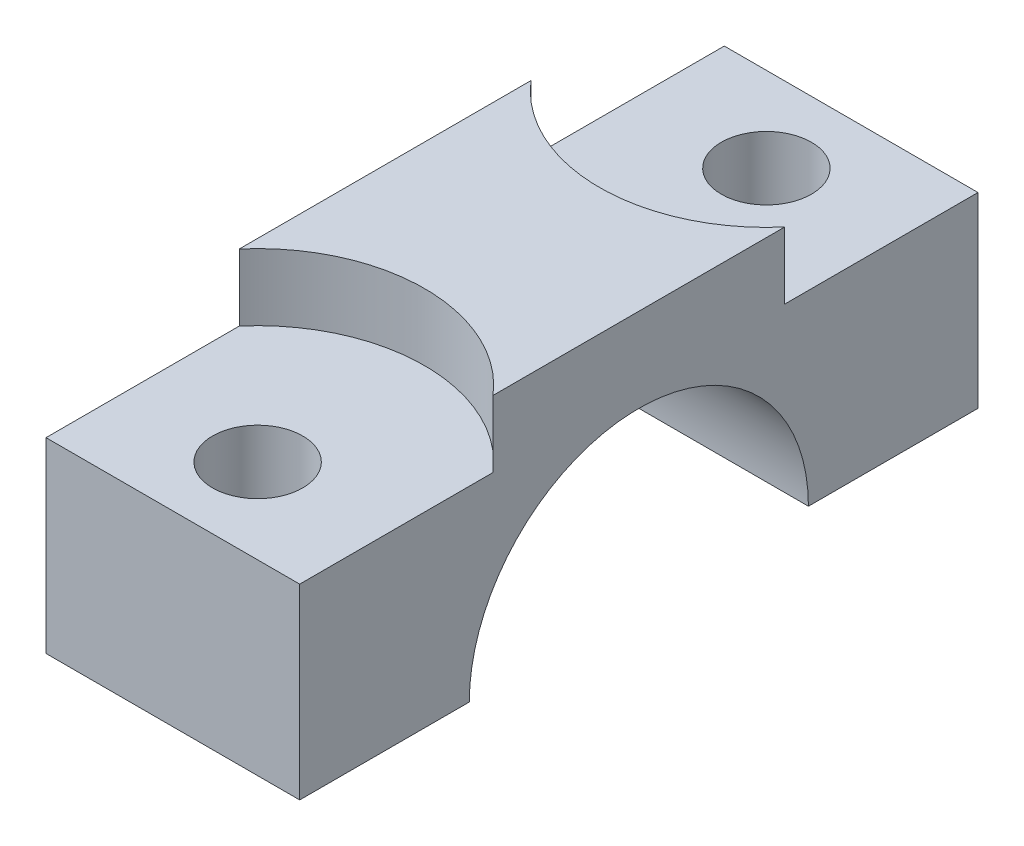
ISO-10303-21;
HEADER;
FILE_DESCRIPTION(('STEP AP214'),'2;1');
FILE_NAME('part.step','',(''),(''),'','','');
FILE_SCHEMA(('AUTOMOTIVE_DESIGN { 1 0 10303 214 1 1 1 1 }'));
ENDSEC;
DATA;
#1=APPLICATION_CONTEXT('core data for automotive mechanical design processes');
#2=APPLICATION_PROTOCOL_DEFINITION('international standard','automotive_design',2000,#1);
#3=PRODUCT_CONTEXT('',#1,'mechanical');
#4=PRODUCT('Part','Part','',(#3));
#5=PRODUCT_RELATED_PRODUCT_CATEGORY('part','',(#4));
#6=PRODUCT_DEFINITION_FORMATION('','',#4);
#7=PRODUCT_DEFINITION_CONTEXT('part definition',#1,'design');
#8=PRODUCT_DEFINITION('design','',#6,#7);
#9=PRODUCT_DEFINITION_SHAPE('','',#8);
#10=(LENGTH_UNIT() NAMED_UNIT(*) SI_UNIT(.MILLI.,.METRE.));
#11=(NAMED_UNIT(*) PLANE_ANGLE_UNIT() SI_UNIT($,.RADIAN.));
#12=(NAMED_UNIT(*) SI_UNIT($,.STERADIAN.) SOLID_ANGLE_UNIT());
#13=UNCERTAINTY_MEASURE_WITH_UNIT(LENGTH_MEASURE(1.E-05),#10,'distance_accuracy_value','');
#14=(GEOMETRIC_REPRESENTATION_CONTEXT(3) GLOBAL_UNCERTAINTY_ASSIGNED_CONTEXT((#13)) GLOBAL_UNIT_ASSIGNED_CONTEXT((#10,
#11,#12)) REPRESENTATION_CONTEXT('',''));
#15=CARTESIAN_POINT('',(0.,0.,0.));
#16=DIRECTION('',(0.,0.,1.));
#17=DIRECTION('',(1.,0.,0.));
#18=AXIS2_PLACEMENT_3D('',#15,#16,#17);
#19=CARTESIAN_POINT('',(9.5,0.,0.));
#20=DIRECTION('',(-1.,0.,0.));
#21=DIRECTION('',(0.,0.,1.));
#22=AXIS2_PLACEMENT_3D('',#19,#20,#21);
#23=CYLINDRICAL_SURFACE('',#22,12.7);
#24=CARTESIAN_POINT('',(-9.5,0.,0.));
#25=DIRECTION('',(1.,0.,0.));
#26=DIRECTION('',(0.,0.,-1.));
#27=AXIS2_PLACEMENT_3D('',#24,#25,#26);
#28=CIRCLE('',#27,12.7);
#29=CARTESIAN_POINT('',(-9.5,0.,-12.7));
#30=VERTEX_POINT('',#29);
#31=CARTESIAN_POINT('',(-9.5,0.,12.7));
#32=VERTEX_POINT('',#31);
#33=EDGE_CURVE('E152',#30,#32,#28,.T.);
#34=ORIENTED_EDGE('',*,*,#33,.F.);
#35=DIRECTION('',(-1.,0.,0.));
#36=VECTOR('',#35,1.);
#37=CARTESIAN_POINT('',(9.5,0.,-12.7));
#38=LINE('',#37,#36);
#39=CARTESIAN_POINT('',(9.5,0.,-12.7));
#40=VERTEX_POINT('',#39);
#41=EDGE_CURVE('E185',#40,#30,#38,.T.);
#42=ORIENTED_EDGE('',*,*,#41,.F.);
#43=CARTESIAN_POINT('',(9.5,0.,0.));
#44=DIRECTION('',(1.,0.,0.));
#45=DIRECTION('',(0.,0.,-1.));
#46=AXIS2_PLACEMENT_3D('',#43,#44,#45);
#47=CIRCLE('',#46,12.7);
#48=CARTESIAN_POINT('',(9.5,0.,12.7));
#49=VERTEX_POINT('',#48);
#50=EDGE_CURVE('E153',#40,#49,#47,.T.);
#51=ORIENTED_EDGE('',*,*,#50,.T.);
#52=DIRECTION('',(-1.,0.,0.));
#53=VECTOR('',#52,1.);
#54=CARTESIAN_POINT('',(9.5,0.,12.7));
#55=LINE('',#54,#53);
#56=EDGE_CURVE('E177',#49,#32,#55,.T.);
#57=ORIENTED_EDGE('',*,*,#56,.T.);
#58=EDGE_LOOP('',(#34,#42,#51,#57));
#59=FACE_BOUND('',#58,.T.);
#60=ADVANCED_FACE('F35',(#59),#23,.F.);
#61=CARTESIAN_POINT('',(9.5,0.,0.));
#62=DIRECTION('',(0.,1.,0.));
#63=DIRECTION('',(0.,0.,1.));
#64=AXIS2_PLACEMENT_3D('',#61,#62,#63);
#65=PLANE('',#64);
#66=CARTESIAN_POINT('',(0.,0.,-19.05));
#67=DIRECTION('',(0.,1.,0.));
#68=DIRECTION('',(0.,0.,1.));
#69=AXIS2_PLACEMENT_3D('',#66,#67,#68);
#70=CIRCLE('',#69,3.37500000000001);
#71=CARTESIAN_POINT('',(0.,0.,-15.675));
#72=VERTEX_POINT('',#71);
#73=EDGE_CURVE('E118',#72,#72,#70,.T.);
#74=ORIENTED_EDGE('',*,*,#73,.T.);
#75=EDGE_LOOP('',(#74));
#76=FACE_BOUND('',#75,.T.);
#77=DIRECTION('',(0.,0.,-1.));
#78=VECTOR('',#77,1.);
#79=CARTESIAN_POINT('',(-9.5,0.,0.));
#80=LINE('',#79,#78);
#81=CARTESIAN_POINT('',(-9.5,0.,-25.4));
#82=VERTEX_POINT('',#81);
#83=EDGE_CURVE('E167',#30,#82,#80,.T.);
#84=ORIENTED_EDGE('',*,*,#83,.T.);
#85=DIRECTION('',(-1.,0.,0.));
#86=VECTOR('',#85,1.);
#87=CARTESIAN_POINT('',(9.5,0.,-25.4));
#88=LINE('',#87,#86);
#89=CARTESIAN_POINT('',(9.5,0.,-25.4));
#90=VERTEX_POINT('',#89);
#91=EDGE_CURVE('E182',#90,#82,#88,.T.);
#92=ORIENTED_EDGE('',*,*,#91,.F.);
#93=DIRECTION('',(0.,0.,-1.));
#94=VECTOR('',#93,1.);
#95=CARTESIAN_POINT('',(9.5,0.,0.));
#96=LINE('',#95,#94);
#97=EDGE_CURVE('E156',#40,#90,#96,.T.);
#98=ORIENTED_EDGE('',*,*,#97,.F.);
#99=ORIENTED_EDGE('',*,*,#41,.T.);
#100=EDGE_LOOP('',(#84,#92,#98,#99));
#101=FACE_BOUND('',#100,.T.);
#102=ADVANCED_FACE('F204',(#76,#101),#65,.F.);
#103=CARTESIAN_POINT('',(9.5,0.,-25.4));
#104=DIRECTION('',(0.,0.,-1.));
#105=DIRECTION('',(-1.,0.,0.));
#106=AXIS2_PLACEMENT_3D('',#103,#104,#105);
#107=PLANE('',#106);
#108=DIRECTION('',(-1.,0.,0.));
#109=VECTOR('',#108,1.);
#110=CARTESIAN_POINT('',(9.5,14.,-25.4));
#111=LINE('',#110,#109);
#112=CARTESIAN_POINT('',(9.5,14.,-25.4));
#113=VERTEX_POINT('',#112);
#114=CARTESIAN_POINT('',(-9.5,14.,-25.4));
#115=VERTEX_POINT('',#114);
#116=EDGE_CURVE('E117',#113,#115,#111,.T.);
#117=ORIENTED_EDGE('',*,*,#116,.F.);
#118=DIRECTION('',(0.,-1.,0.));
#119=VECTOR('',#118,1.);
#120=CARTESIAN_POINT('',(9.5,0.,-25.4));
#121=LINE('',#120,#119);
#122=EDGE_CURVE('E131',#113,#90,#121,.T.);
#123=ORIENTED_EDGE('',*,*,#122,.T.);
#124=ORIENTED_EDGE('',*,*,#91,.T.);
#125=DIRECTION('',(0.,-1.,0.));
#126=VECTOR('',#125,1.);
#127=CARTESIAN_POINT('',(-9.5,0.,-25.4));
#128=LINE('',#127,#126);
#129=EDGE_CURVE('E170',#115,#82,#128,.T.);
#130=ORIENTED_EDGE('',*,*,#129,.F.);
#131=EDGE_LOOP('',(#117,#123,#124,#130));
#132=FACE_BOUND('',#131,.T.);
#133=ADVANCED_FACE('F224',(#132),#107,.T.);
#134=CARTESIAN_POINT('',(9.5,19.,0.));
#135=DIRECTION('',(0.,1.,0.));
#136=DIRECTION('',(0.,0.,1.));
#137=AXIS2_PLACEMENT_3D('',#134,#135,#136);
#138=PLANE('',#137);
#139=CARTESIAN_POINT('',(0.,19.,-19.05));
#140=DIRECTION('',(0.,1.,0.));
#141=DIRECTION('',(0.,0.,1.));
#142=AXIS2_PLACEMENT_3D('',#139,#140,#141);
#143=CIRCLE('',#142,12.5);
#144=CARTESIAN_POINT('',(-9.5,19.,-10.925961595364));
#145=VERTEX_POINT('',#144);
#146=CARTESIAN_POINT('',(9.5,19.,-10.925961595364));
#147=VERTEX_POINT('',#146);
#148=EDGE_CURVE('E112',#145,#147,#143,.T.);
#149=ORIENTED_EDGE('',*,*,#148,.F.);
#150=DIRECTION('',(0.,0.,-1.));
#151=VECTOR('',#150,1.);
#152=CARTESIAN_POINT('',(-9.5,19.,0.));
#153=LINE('',#152,#151);
#154=CARTESIAN_POINT('',(-9.5,19.,10.925961595364));
#155=VERTEX_POINT('',#154);
#156=EDGE_CURVE('E172',#155,#145,#153,.T.);
#157=ORIENTED_EDGE('',*,*,#156,.F.);
#158=CARTESIAN_POINT('',(0.,19.,19.05));
#159=DIRECTION('',(0.,1.,0.));
#160=DIRECTION('',(0.,0.,1.));
#161=AXIS2_PLACEMENT_3D('',#158,#159,#160);
#162=CIRCLE('',#161,12.5);
#163=CARTESIAN_POINT('',(9.5,19.,10.925961595364));
#164=VERTEX_POINT('',#163);
#165=EDGE_CURVE('E57',#164,#155,#162,.T.);
#166=ORIENTED_EDGE('',*,*,#165,.F.);
#167=DIRECTION('',(0.,0.,-1.));
#168=VECTOR('',#167,1.);
#169=CARTESIAN_POINT('',(9.5,19.,0.));
#170=LINE('',#169,#168);
#171=EDGE_CURVE('E161',#164,#147,#170,.T.);
#172=ORIENTED_EDGE('',*,*,#171,.T.);
#173=EDGE_LOOP('',(#149,#157,#166,#172));
#174=FACE_BOUND('',#173,.T.);
#175=ADVANCED_FACE('F196',(#174),#138,.T.);
#176=CARTESIAN_POINT('',(9.5,0.,25.4));
#177=DIRECTION('',(0.,0.,-1.));
#178=DIRECTION('',(-1.,0.,0.));
#179=AXIS2_PLACEMENT_3D('',#176,#177,#178);
#180=PLANE('',#179);
#181=DIRECTION('',(0.,-1.,0.));
#182=VECTOR('',#181,1.);
#183=CARTESIAN_POINT('',(9.5,0.,25.4));
#184=LINE('',#183,#182);
#185=CARTESIAN_POINT('',(9.5,14.,25.4));
#186=VERTEX_POINT('',#185);
#187=CARTESIAN_POINT('',(9.5,0.,25.4));
#188=VERTEX_POINT('',#187);
#189=EDGE_CURVE('E163',#186,#188,#184,.T.);
#190=ORIENTED_EDGE('',*,*,#189,.F.);
#191=DIRECTION('',(-1.,0.,0.));
#192=VECTOR('',#191,1.);
#193=CARTESIAN_POINT('',(9.5,14.,25.4));
#194=LINE('',#193,#192);
#195=CARTESIAN_POINT('',(-9.5,14.,25.4));
#196=VERTEX_POINT('',#195);
#197=EDGE_CURVE('E147',#186,#196,#194,.T.);
#198=ORIENTED_EDGE('',*,*,#197,.T.);
#199=DIRECTION('',(0.,-1.,0.));
#200=VECTOR('',#199,1.);
#201=CARTESIAN_POINT('',(-9.5,0.,25.4));
#202=LINE('',#201,#200);
#203=CARTESIAN_POINT('',(-9.5,0.,25.4));
#204=VERTEX_POINT('',#203);
#205=EDGE_CURVE('E175',#196,#204,#202,.T.);
#206=ORIENTED_EDGE('',*,*,#205,.T.);
#207=DIRECTION('',(-1.,0.,0.));
#208=VECTOR('',#207,1.);
#209=CARTESIAN_POINT('',(9.5,0.,25.4));
#210=LINE('',#209,#208);
#211=EDGE_CURVE('E179',#188,#204,#210,.T.);
#212=ORIENTED_EDGE('',*,*,#211,.F.);
#213=EDGE_LOOP('',(#190,#198,#206,#212));
#214=FACE_BOUND('',#213,.T.);
#215=ADVANCED_FACE('F242',(#214),#180,.F.);
#216=CARTESIAN_POINT('',(0.,0.,19.05));
#217=DIRECTION('',(0.,1.,0.));
#218=DIRECTION('',(0.,0.,1.));
#219=AXIS2_PLACEMENT_3D('',#216,#217,#218);
#220=CIRCLE('',#219,3.37500000000001);
#221=CARTESIAN_POINT('',(0.,0.,22.425));
#222=VERTEX_POINT('',#221);
#223=EDGE_CURVE('E142',#222,#222,#220,.T.);
#224=ORIENTED_EDGE('',*,*,#223,.T.);
#225=EDGE_LOOP('',(#224));
#226=FACE_BOUND('',#225,.T.);
#227=EDGE_CURVE('E157',#204,#32,#80,.T.);
#228=ORIENTED_EDGE('',*,*,#227,.T.);
#229=ORIENTED_EDGE('',*,*,#56,.F.);
#230=EDGE_CURVE('E159',#188,#49,#96,.T.);
#231=ORIENTED_EDGE('',*,*,#230,.F.);
#232=ORIENTED_EDGE('',*,*,#211,.T.);
#233=EDGE_LOOP('',(#228,#229,#231,#232));
#234=FACE_BOUND('',#233,.T.);
#235=ADVANCED_FACE('F226',(#226,#234),#65,.F.);
#236=CARTESIAN_POINT('',(9.5,0.,0.));
#237=DIRECTION('',(1.,0.,0.));
#238=DIRECTION('',(0.,0.,-1.));
#239=AXIS2_PLACEMENT_3D('',#236,#237,#238);
#240=PLANE('',#239);
#241=DIRECTION('',(0.,1.,0.));
#242=VECTOR('',#241,1.);
#243=CARTESIAN_POINT('',(9.5,19.,-10.925961595364));
#244=LINE('',#243,#242);
#245=CARTESIAN_POINT('',(9.5,14.,-10.925961595364));
#246=VERTEX_POINT('',#245);
#247=EDGE_CURVE('E109',#147,#246,#244,.F.);
#248=ORIENTED_EDGE('',*,*,#247,.F.);
#249=ORIENTED_EDGE('',*,*,#171,.F.);
#250=DIRECTION('',(0.,1.,0.));
#251=VECTOR('',#250,1.);
#252=CARTESIAN_POINT('',(9.5,19.,10.925961595364));
#253=LINE('',#252,#251);
#254=CARTESIAN_POINT('',(9.5,14.,10.925961595364));
#255=VERTEX_POINT('',#254);
#256=EDGE_CURVE('E145',#255,#164,#253,.T.);
#257=ORIENTED_EDGE('',*,*,#256,.F.);
#258=DIRECTION('',(0.,0.,-1.));
#259=VECTOR('',#258,1.);
#260=CARTESIAN_POINT('',(9.5,14.,0.));
#261=LINE('',#260,#259);
#262=EDGE_CURVE('E150',#186,#255,#261,.T.);
#263=ORIENTED_EDGE('',*,*,#262,.F.);
#264=ORIENTED_EDGE('',*,*,#189,.T.);
#265=ORIENTED_EDGE('',*,*,#230,.T.);
#266=ORIENTED_EDGE('',*,*,#50,.F.);
#267=ORIENTED_EDGE('',*,*,#97,.T.);
#268=ORIENTED_EDGE('',*,*,#122,.F.);
#269=DIRECTION('',(0.,0.,-1.));
#270=VECTOR('',#269,1.);
#271=CARTESIAN_POINT('',(9.5,14.,0.));
#272=LINE('',#271,#270);
#273=EDGE_CURVE('E123',#246,#113,#272,.T.);
#274=ORIENTED_EDGE('',*,*,#273,.F.);
#275=EDGE_LOOP('',(#248,#249,#257,#263,#264,#265,#266,#267,#268,#274));
#276=FACE_BOUND('',#275,.T.);
#277=ADVANCED_FACE('F129',(#276),#240,.T.);
#278=CARTESIAN_POINT('',(-9.5,0.,0.));
#279=DIRECTION('',(1.,0.,0.));
#280=DIRECTION('',(0.,0.,-1.));
#281=AXIS2_PLACEMENT_3D('',#278,#279,#280);
#282=PLANE('',#281);
#283=DIRECTION('',(0.,1.,0.));
#284=VECTOR('',#283,1.);
#285=CARTESIAN_POINT('',(-9.5,19.,-10.925961595364));
#286=LINE('',#285,#284);
#287=CARTESIAN_POINT('',(-9.5,14.,-10.925961595364));
#288=VERTEX_POINT('',#287);
#289=EDGE_CURVE('E42',#145,#288,#286,.F.);
#290=ORIENTED_EDGE('',*,*,#289,.T.);
#291=DIRECTION('',(0.,0.,-1.));
#292=VECTOR('',#291,1.);
#293=CARTESIAN_POINT('',(-9.5,14.,0.));
#294=LINE('',#293,#292);
#295=EDGE_CURVE('E11',#288,#115,#294,.T.);
#296=ORIENTED_EDGE('',*,*,#295,.T.);
#297=ORIENTED_EDGE('',*,*,#129,.T.);
#298=ORIENTED_EDGE('',*,*,#83,.F.);
#299=ORIENTED_EDGE('',*,*,#33,.T.);
#300=ORIENTED_EDGE('',*,*,#227,.F.);
#301=ORIENTED_EDGE('',*,*,#205,.F.);
#302=DIRECTION('',(0.,0.,-1.));
#303=VECTOR('',#302,1.);
#304=CARTESIAN_POINT('',(-9.5,14.,0.));
#305=LINE('',#304,#303);
#306=CARTESIAN_POINT('',(-9.5,14.,10.925961595364));
#307=VERTEX_POINT('',#306);
#308=EDGE_CURVE('E189',#196,#307,#305,.T.);
#309=ORIENTED_EDGE('',*,*,#308,.T.);
#310=DIRECTION('',(0.,1.,0.));
#311=VECTOR('',#310,1.);
#312=CARTESIAN_POINT('',(-9.5,19.,10.925961595364));
#313=LINE('',#312,#311);
#314=EDGE_CURVE('E187',#307,#155,#313,.T.);
#315=ORIENTED_EDGE('',*,*,#314,.T.);
#316=ORIENTED_EDGE('',*,*,#156,.T.);
#317=EDGE_LOOP('',(#290,#296,#297,#298,#299,#300,#301,#309,#315,#316));
#318=FACE_BOUND('',#317,.T.);
#319=ADVANCED_FACE('F192',(#318),#282,.F.);
#320=CARTESIAN_POINT('',(0.,19.,19.05));
#321=DIRECTION('',(0.,1.,0.));
#322=DIRECTION('',(0.,0.,1.));
#323=AXIS2_PLACEMENT_3D('',#320,#321,#322);
#324=CYLINDRICAL_SURFACE('',#323,3.37500000000001);
#325=ORIENTED_EDGE('',*,*,#223,.F.);
#326=EDGE_LOOP('',(#325));
#327=FACE_BOUND('',#326,.T.);
#328=CARTESIAN_POINT('',(0.,14.,19.05));
#329=DIRECTION('',(0.,1.,0.));
#330=DIRECTION('',(0.,0.,1.));
#331=AXIS2_PLACEMENT_3D('',#328,#329,#330);
#332=CIRCLE('',#331,3.37500000000001);
#333=CARTESIAN_POINT('',(0.,14.,22.425));
#334=VERTEX_POINT('',#333);
#335=EDGE_CURVE('E139',#334,#334,#332,.T.);
#336=ORIENTED_EDGE('',*,*,#335,.T.);
#337=EDGE_LOOP('',(#336));
#338=FACE_BOUND('',#337,.T.);
#339=ADVANCED_FACE('F253',(#327,#338),#324,.F.);
#340=CARTESIAN_POINT('',(3.37500000000001,14.,19.05));
#341=DIRECTION('',(0.,-1.,0.));
#342=DIRECTION('',(0.,0.,-1.));
#343=AXIS2_PLACEMENT_3D('',#340,#341,#342);
#344=PLANE('',#343);
#345=ORIENTED_EDGE('',*,*,#262,.T.);
#346=CARTESIAN_POINT('',(0.,14.,19.05));
#347=DIRECTION('',(0.,1.,0.));
#348=DIRECTION('',(0.,0.,1.));
#349=AXIS2_PLACEMENT_3D('',#346,#347,#348);
#350=CIRCLE('',#349,12.5);
#351=EDGE_CURVE('E133',#255,#307,#350,.T.);
#352=ORIENTED_EDGE('',*,*,#351,.T.);
#353=ORIENTED_EDGE('',*,*,#308,.F.);
#354=ORIENTED_EDGE('',*,*,#197,.F.);
#355=EDGE_LOOP('',(#345,#352,#353,#354));
#356=FACE_BOUND('',#355,.T.);
#357=ORIENTED_EDGE('',*,*,#335,.F.);
#358=EDGE_LOOP('',(#357));
#359=FACE_BOUND('',#358,.T.);
#360=ADVANCED_FACE('F244',(#356,#359),#344,.F.);
#361=CARTESIAN_POINT('',(0.,19.,19.05));
#362=DIRECTION('',(0.,1.,0.));
#363=DIRECTION('',(0.,0.,1.));
#364=AXIS2_PLACEMENT_3D('',#361,#362,#363);
#365=CYLINDRICAL_SURFACE('',#364,12.5);
#366=ORIENTED_EDGE('',*,*,#256,.T.);
#367=ORIENTED_EDGE('',*,*,#165,.T.);
#368=ORIENTED_EDGE('',*,*,#314,.F.);
#369=ORIENTED_EDGE('',*,*,#351,.F.);
#370=EDGE_LOOP('',(#366,#367,#368,#369));
#371=FACE_BOUND('',#370,.T.);
#372=ADVANCED_FACE('F210',(#371),#365,.F.);
#373=CARTESIAN_POINT('',(0.,19.,-19.05));
#374=DIRECTION('',(0.,1.,0.));
#375=DIRECTION('',(0.,0.,1.));
#376=AXIS2_PLACEMENT_3D('',#373,#374,#375);
#377=CYLINDRICAL_SURFACE('',#376,3.37500000000001);
#378=ORIENTED_EDGE('',*,*,#73,.F.);
#379=EDGE_LOOP('',(#378));
#380=FACE_BOUND('',#379,.T.);
#381=CARTESIAN_POINT('',(0.,14.,-19.05));
#382=DIRECTION('',(0.,1.,0.));
#383=DIRECTION('',(0.,0.,1.));
#384=AXIS2_PLACEMENT_3D('',#381,#382,#383);
#385=CIRCLE('',#384,3.37500000000001);
#386=CARTESIAN_POINT('',(0.,14.,-15.675));
#387=VERTEX_POINT('',#386);
#388=EDGE_CURVE('E126',#387,#387,#385,.T.);
#389=ORIENTED_EDGE('',*,*,#388,.T.);
#390=EDGE_LOOP('',(#389));
#391=FACE_BOUND('',#390,.T.);
#392=ADVANCED_FACE('F207',(#380,#391),#377,.F.);
#393=CARTESIAN_POINT('',(3.37500000000001,14.,-19.05));
#394=DIRECTION('',(0.,-1.,0.));
#395=DIRECTION('',(0.,0.,-1.));
#396=AXIS2_PLACEMENT_3D('',#393,#394,#395);
#397=PLANE('',#396);
#398=ORIENTED_EDGE('',*,*,#273,.T.);
#399=ORIENTED_EDGE('',*,*,#116,.T.);
#400=ORIENTED_EDGE('',*,*,#295,.F.);
#401=CARTESIAN_POINT('',(0.,14.,-19.05));
#402=DIRECTION('',(0.,1.,0.));
#403=DIRECTION('',(0.,0.,1.));
#404=AXIS2_PLACEMENT_3D('',#401,#402,#403);
#405=CIRCLE('',#404,12.5);
#406=EDGE_CURVE('E49',#288,#246,#405,.T.);
#407=ORIENTED_EDGE('',*,*,#406,.T.);
#408=EDGE_LOOP('',(#398,#399,#400,#407));
#409=FACE_BOUND('',#408,.T.);
#410=ORIENTED_EDGE('',*,*,#388,.F.);
#411=EDGE_LOOP('',(#410));
#412=FACE_BOUND('',#411,.T.);
#413=ADVANCED_FACE('F121',(#409,#412),#397,.F.);
#414=CARTESIAN_POINT('',(0.,19.,-19.05));
#415=DIRECTION('',(0.,1.,0.));
#416=DIRECTION('',(0.,0.,1.));
#417=AXIS2_PLACEMENT_3D('',#414,#415,#416);
#418=CYLINDRICAL_SURFACE('',#417,12.5);
#419=ORIENTED_EDGE('',*,*,#247,.T.);
#420=ORIENTED_EDGE('',*,*,#406,.F.);
#421=ORIENTED_EDGE('',*,*,#289,.F.);
#422=ORIENTED_EDGE('',*,*,#148,.T.);
#423=EDGE_LOOP('',(#419,#420,#421,#422));
#424=FACE_BOUND('',#423,.T.);
#425=ADVANCED_FACE('F110',(#424),#418,.F.);
#426=CLOSED_SHELL('',(#60,#102,#133,#175,#215,#235,#277,#319,#339,#360,#372,#392,#413,#425));
#427=MANIFOLD_SOLID_BREP('B2',#426);
#428=ADVANCED_BREP_SHAPE_REPRESENTATION('',(#18,#427),#14);
#429=SHAPE_DEFINITION_REPRESENTATION(#9,#428);
ENDSEC;
END-ISO-10303-21;
